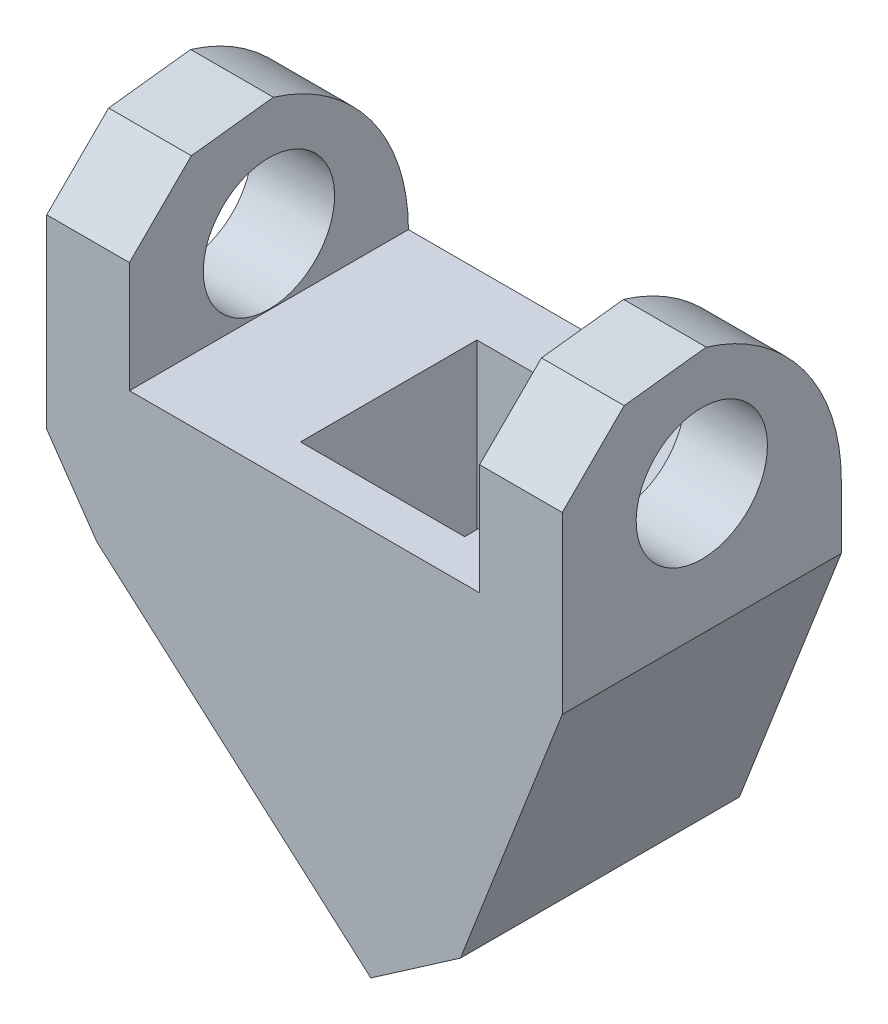
ISO-10303-21;
HEADER;
FILE_DESCRIPTION(('STEP AP214'),'2;1');
FILE_NAME('part.step','',(''),(''),'','','');
FILE_SCHEMA(('AUTOMOTIVE_DESIGN { 1 0 10303 214 1 1 1 1 }'));
ENDSEC;
DATA;
#1=APPLICATION_CONTEXT('core data for automotive mechanical design processes');
#2=APPLICATION_PROTOCOL_DEFINITION('international standard','automotive_design',2000,#1);
#3=PRODUCT_CONTEXT('',#1,'mechanical');
#4=PRODUCT('Part','Part','',(#3));
#5=PRODUCT_RELATED_PRODUCT_CATEGORY('part','',(#4));
#6=PRODUCT_DEFINITION_FORMATION('','',#4);
#7=PRODUCT_DEFINITION_CONTEXT('part definition',#1,'design');
#8=PRODUCT_DEFINITION('design','',#6,#7);
#9=PRODUCT_DEFINITION_SHAPE('','',#8);
#10=(LENGTH_UNIT() NAMED_UNIT(*) SI_UNIT(.MILLI.,.METRE.));
#11=(NAMED_UNIT(*) PLANE_ANGLE_UNIT() SI_UNIT($,.RADIAN.));
#12=(NAMED_UNIT(*) SI_UNIT($,.STERADIAN.) SOLID_ANGLE_UNIT());
#13=UNCERTAINTY_MEASURE_WITH_UNIT(LENGTH_MEASURE(1.E-05),#10,'distance_accuracy_value','');
#14=(GEOMETRIC_REPRESENTATION_CONTEXT(3) GLOBAL_UNCERTAINTY_ASSIGNED_CONTEXT((#13)) GLOBAL_UNIT_ASSIGNED_CONTEXT((#10,
#11,#12)) REPRESENTATION_CONTEXT('',''));
#15=CARTESIAN_POINT('',(0.,0.,0.));
#16=DIRECTION('',(0.,0.,1.));
#17=DIRECTION('',(1.,0.,0.));
#18=AXIS2_PLACEMENT_3D('',#15,#16,#17);
#19=CARTESIAN_POINT('',(-6.62620064692458,-23.6390631964154,17.));
#20=DIRECTION('',(0.660001667960941,0.751264133503508,0.));
#21=DIRECTION('',(-0.751264133503508,0.660001667960941,0.));
#22=AXIS2_PLACEMENT_3D('',#19,#20,#21);
#23=PLANE('',#22);
#24=DIRECTION('',(0.751264133503508,-0.660001667960941,0.));
#25=VECTOR('',#24,1.);
#26=CARTESIAN_POINT('',(-6.62620064692458,-23.6390631964154,0.));
#27=LINE('',#26,#25);
#28=CARTESIAN_POINT('',(-23.3192896933725,-8.97382613432327,0.));
#29=VERTEX_POINT('',#28);
#30=CARTESIAN_POINT('',(-6.62620064692458,-23.6390631964154,0.));
#31=VERTEX_POINT('',#30);
#32=EDGE_CURVE('E295',#29,#31,#27,.T.);
#33=ORIENTED_EDGE('',*,*,#32,.T.);
#34=DIRECTION('',(0.,0.,-1.));
#35=VECTOR('',#34,1.);
#36=CARTESIAN_POINT('',(-6.62620064692458,-23.6390631964154,17.));
#37=LINE('',#36,#35);
#38=CARTESIAN_POINT('',(-6.62620064692458,-23.6390631964154,17.));
#39=VERTEX_POINT('',#38);
#40=EDGE_CURVE('E311',#39,#31,#37,.T.);
#41=ORIENTED_EDGE('',*,*,#40,.F.);
#42=DIRECTION('',(0.751264133503508,-0.660001667960941,0.));
#43=VECTOR('',#42,1.);
#44=CARTESIAN_POINT('',(-6.62620064692458,-23.6390631964154,17.));
#45=LINE('',#44,#43);
#46=CARTESIAN_POINT('',(-23.3192896933725,-8.97382613432327,17.));
#47=VERTEX_POINT('',#46);
#48=EDGE_CURVE('E277',#47,#39,#45,.T.);
#49=ORIENTED_EDGE('',*,*,#48,.F.);
#50=DIRECTION('',(0.,0.,-1.));
#51=VECTOR('',#50,1.);
#52=CARTESIAN_POINT('',(-23.3192896933725,-8.97382613432327,17.));
#53=LINE('',#52,#51);
#54=EDGE_CURVE('E314',#47,#29,#53,.T.);
#55=ORIENTED_EDGE('',*,*,#54,.T.);
#56=EDGE_LOOP('',(#33,#41,#49,#55));
#57=FACE_BOUND('',#56,.T.);
#58=DIRECTION('',(-0.751264133503508,0.660001667960941,0.));
#59=VECTOR('',#58,1.);
#60=CARTESIAN_POINT('',(-16.9149851575088,-14.6001451442406,3.73999999999995));
#61=LINE('',#60,#59);
#62=CARTESIAN_POINT('',(-9.64628246360861,-20.9858564912125,3.73999999999995));
#63=VERTEX_POINT('',#62);
#64=CARTESIAN_POINT('',(-16.7607538078868,-14.7356406956223,3.73999999999995));
#65=VERTEX_POINT('',#64);
#66=EDGE_CURVE('E212',#63,#65,#61,.T.);
#67=ORIENTED_EDGE('',*,*,#66,.T.);
#68=DIRECTION('',(0.,0.,1.));
#69=VECTOR('',#68,1.);
#70=CARTESIAN_POINT('',(-16.7607538078868,-14.7356406956223,3.73999999999995));
#71=LINE('',#70,#69);
#72=CARTESIAN_POINT('',(-16.7607538078868,-14.7356406956223,14.4899999999999));
#73=VERTEX_POINT('',#72);
#74=EDGE_CURVE('E208',#65,#73,#71,.T.);
#75=ORIENTED_EDGE('',*,*,#74,.T.);
#76=DIRECTION('',(0.751264133503508,-0.660001667960941,0.));
#77=VECTOR('',#76,1.);
#78=CARTESIAN_POINT('',(-16.9149851575088,-14.6001451442406,14.4899999999999));
#79=LINE('',#78,#77);
#80=CARTESIAN_POINT('',(-9.64628246360861,-20.9858564912125,14.4899999999999));
#81=VERTEX_POINT('',#80);
#82=EDGE_CURVE('E211',#73,#81,#79,.T.);
#83=ORIENTED_EDGE('',*,*,#82,.T.);
#84=DIRECTION('',(0.,0.,-1.));
#85=VECTOR('',#84,1.);
#86=CARTESIAN_POINT('',(-9.64628246360861,-20.9858564912125,3.73999999999995));
#87=LINE('',#86,#85);
#88=EDGE_CURVE('E214',#81,#63,#87,.T.);
#89=ORIENTED_EDGE('',*,*,#88,.T.);
#90=EDGE_LOOP('',(#67,#75,#83,#89));
#91=FACE_BOUND('',#90,.T.);
#92=ADVANCED_FACE('F33',(#57,#91),#23,.F.);
#93=CARTESIAN_POINT('',(-21.3355501398711,11.1,17.));
#94=DIRECTION('',(-1.,0.,0.));
#95=DIRECTION('',(0.,-1.,0.));
#96=AXIS2_PLACEMENT_3D('',#93,#94,#95);
#97=PLANE('',#96);
#98=CARTESIAN_POINT('',(-21.3355501398711,4.04162085133609,8.5));
#99=DIRECTION('',(-1.,0.,0.));
#100=DIRECTION('',(0.,-1.,0.));
#101=AXIS2_PLACEMENT_3D('',#98,#99,#100);
#102=CIRCLE('',#101,4.);
#103=CARTESIAN_POINT('',(-21.3355501398711,0.0416208513360841,8.5));
#104=VERTEX_POINT('',#103);
#105=EDGE_CURVE('E435',#104,#104,#102,.T.);
#106=ORIENTED_EDGE('',*,*,#105,.T.);
#107=EDGE_LOOP('',(#106));
#108=FACE_BOUND('',#107,.T.);
#109=DIRECTION('',(0.,0.705253158861616,-0.708955557080775));
#110=VECTOR('',#109,1.);
#111=CARTESIAN_POINT('',(-21.3355501398711,8.91863795848581,14.8300297458231));
#112=LINE('',#111,#110);
#113=CARTESIAN_POINT('',(-21.3355501398711,6.76,17.));
#114=VERTEX_POINT('',#113);
#115=CARTESIAN_POINT('',(-21.3355501398711,10.5122475955982,13.2280540668032));
#116=VERTEX_POINT('',#115);
#117=EDGE_CURVE('E257',#114,#116,#112,.T.);
#118=ORIENTED_EDGE('',*,*,#117,.F.);
#119=DIRECTION('',(0.,1.,0.));
#120=VECTOR('',#119,1.);
#121=CARTESIAN_POINT('',(-21.3355501398711,11.1,17.));
#122=LINE('',#121,#120);
#123=CARTESIAN_POINT('',(-21.3355501398711,0.,17.));
#124=VERTEX_POINT('',#123);
#125=EDGE_CURVE('E269',#124,#114,#122,.T.);
#126=ORIENTED_EDGE('',*,*,#125,.F.);
#127=DIRECTION('',(0.,0.,-1.));
#128=VECTOR('',#127,1.);
#129=CARTESIAN_POINT('',(-21.3355501398711,0.,17.));
#130=LINE('',#129,#128);
#131=CARTESIAN_POINT('',(-21.3355501398711,0.,0.));
#132=VERTEX_POINT('',#131);
#133=EDGE_CURVE('E320',#124,#132,#130,.T.);
#134=ORIENTED_EDGE('',*,*,#133,.T.);
#135=CARTESIAN_POINT('',(-21.3355501398711,0.,11.6012165316514));
#136=DIRECTION('',(-1.,0.,0.));
#137=DIRECTION('',(0.,-1.,0.));
#138=AXIS2_PLACEMENT_3D('',#135,#136,#137);
#139=CIRCLE('',#138,11.6012165316514);
#140=CARTESIAN_POINT('',(-21.3355501398711,11.1,8.22805406680315));
#141=VERTEX_POINT('',#140);
#142=EDGE_CURVE('E249',#141,#132,#139,.T.);
#143=ORIENTED_EDGE('',*,*,#142,.F.);
#144=DIRECTION('',(0.,0.116746638974287,-0.993161730177018));
#145=VECTOR('',#144,1.);
#146=CARTESIAN_POINT('',(-21.3355501398711,10.0829078343711,16.8804403268307));
#147=LINE('',#146,#145);
#148=EDGE_CURVE('E263',#116,#141,#147,.T.);
#149=ORIENTED_EDGE('',*,*,#148,.F.);
#150=EDGE_LOOP('',(#118,#126,#134,#143,#149));
#151=FACE_BOUND('',#150,.T.);
#152=ADVANCED_FACE('F358',(#108,#151),#97,.F.);
#153=CARTESIAN_POINT('',(-26.3755501398711,-4.55837914866391,17.));
#154=DIRECTION('',(1.,0.,0.));
#155=DIRECTION('',(0.,0.,-1.));
#156=AXIS2_PLACEMENT_3D('',#153,#154,#155);
#157=PLANE('',#156);
#158=CARTESIAN_POINT('',(-26.3755501398711,4.04162085133609,8.5));
#159=DIRECTION('',(1.,0.,0.));
#160=DIRECTION('',(0.,0.,-1.));
#161=AXIS2_PLACEMENT_3D('',#158,#159,#160);
#162=CIRCLE('',#161,4.);
#163=CARTESIAN_POINT('',(-26.3755501398711,4.04162085133609,4.5));
#164=VERTEX_POINT('',#163);
#165=EDGE_CURVE('E433',#164,#164,#162,.T.);
#166=ORIENTED_EDGE('',*,*,#165,.T.);
#167=EDGE_LOOP('',(#166));
#168=FACE_BOUND('',#167,.T.);
#169=DIRECTION('',(0.,-0.705253158861616,0.708955557080775));
#170=VECTOR('',#169,1.);
#171=CARTESIAN_POINT('',(-26.3755501398711,1.13044173759442,22.6591119995615));
#172=LINE('',#171,#170);
#173=CARTESIAN_POINT('',(-26.3755501398711,10.5122475955982,13.2280540668032));
#174=VERTEX_POINT('',#173);
#175=CARTESIAN_POINT('',(-26.3755501398711,6.76,17.));
#176=VERTEX_POINT('',#175);
#177=EDGE_CURVE('E255',#174,#176,#172,.T.);
#178=ORIENTED_EDGE('',*,*,#177,.F.);
#179=DIRECTION('',(0.,-0.116746638974287,0.993161730177018));
#180=VECTOR('',#179,1.);
#181=CARTESIAN_POINT('',(-26.3755501398711,9.86948760724782,18.6960026752353));
#182=LINE('',#181,#180);
#183=CARTESIAN_POINT('',(-26.3755501398711,11.1,8.22805406680315));
#184=VERTEX_POINT('',#183);
#185=EDGE_CURVE('E261',#184,#174,#182,.T.);
#186=ORIENTED_EDGE('',*,*,#185,.F.);
#187=CARTESIAN_POINT('',(-26.3755501398711,0.,11.6012165316514));
#188=DIRECTION('',(1.,0.,0.));
#189=DIRECTION('',(0.,0.,-1.));
#190=AXIS2_PLACEMENT_3D('',#187,#188,#189);
#191=CIRCLE('',#190,11.6012165316514);
#192=CARTESIAN_POINT('',(-26.3755501398711,0.,0.));
#193=VERTEX_POINT('',#192);
#194=EDGE_CURVE('E247',#193,#184,#191,.T.);
#195=ORIENTED_EDGE('',*,*,#194,.F.);
#196=DIRECTION('',(0.,-1.,0.));
#197=VECTOR('',#196,1.);
#198=CARTESIAN_POINT('',(-26.3755501398711,-4.55837914866391,0.));
#199=LINE('',#198,#197);
#200=CARTESIAN_POINT('',(-26.3755501398711,-4.55837914866391,0.));
#201=VERTEX_POINT('',#200);
#202=EDGE_CURVE('E291',#193,#201,#199,.T.);
#203=ORIENTED_EDGE('',*,*,#202,.T.);
#204=DIRECTION('',(0.,0.,-1.));
#205=VECTOR('',#204,1.);
#206=CARTESIAN_POINT('',(-26.3755501398711,-4.55837914866391,17.));
#207=LINE('',#206,#205);
#208=CARTESIAN_POINT('',(-26.3755501398711,-4.55837914866391,17.));
#209=VERTEX_POINT('',#208);
#210=EDGE_CURVE('E317',#209,#201,#207,.T.);
#211=ORIENTED_EDGE('',*,*,#210,.F.);
#212=DIRECTION('',(0.,-1.,0.));
#213=VECTOR('',#212,1.);
#214=CARTESIAN_POINT('',(-26.3755501398711,-4.55837914866391,17.));
#215=LINE('',#214,#213);
#216=EDGE_CURVE('E273',#176,#209,#215,.T.);
#217=ORIENTED_EDGE('',*,*,#216,.F.);
#218=EDGE_LOOP('',(#178,#186,#195,#203,#211,#217));
#219=FACE_BOUND('',#218,.T.);
#220=ADVANCED_FACE('F394',(#168,#219),#157,.F.);
#221=CARTESIAN_POINT('',(5.04,11.1,17.));
#222=DIRECTION('',(-1.,0.,0.));
#223=DIRECTION('',(0.,-1.,0.));
#224=AXIS2_PLACEMENT_3D('',#221,#222,#223);
#225=PLANE('',#224);
#226=CARTESIAN_POINT('',(5.04,4.04162085133608,8.5));
#227=DIRECTION('',(-1.,0.,0.));
#228=DIRECTION('',(0.,-1.,0.));
#229=AXIS2_PLACEMENT_3D('',#226,#227,#228);
#230=CIRCLE('',#229,4.);
#231=CARTESIAN_POINT('',(5.04,0.0416208513360763,8.5));
#232=VERTEX_POINT('',#231);
#233=EDGE_CURVE('E436',#232,#232,#230,.T.);
#234=ORIENTED_EDGE('',*,*,#233,.T.);
#235=EDGE_LOOP('',(#234));
#236=FACE_BOUND('',#235,.T.);
#237=DIRECTION('',(0.,0.705253158861616,-0.708955557080775));
#238=VECTOR('',#237,1.);
#239=CARTESIAN_POINT('',(5.04,8.91863795848581,14.8300297458231));
#240=LINE('',#239,#238);
#241=CARTESIAN_POINT('',(5.04,6.76,17.));
#242=VERTEX_POINT('',#241);
#243=CARTESIAN_POINT('',(5.04,10.5122475955982,13.2280540668032));
#244=VERTEX_POINT('',#243);
#245=EDGE_CURVE('E253',#242,#244,#240,.T.);
#246=ORIENTED_EDGE('',*,*,#245,.F.);
#247=DIRECTION('',(0.,1.,0.));
#248=VECTOR('',#247,1.);
#249=CARTESIAN_POINT('',(5.04,11.1,17.));
#250=LINE('',#249,#248);
#251=CARTESIAN_POINT('',(5.04,-3.9,17.));
#252=VERTEX_POINT('',#251);
#253=EDGE_CURVE('E283',#252,#242,#250,.T.);
#254=ORIENTED_EDGE('',*,*,#253,.F.);
#255=DIRECTION('',(0.,0.,-1.));
#256=VECTOR('',#255,1.);
#257=CARTESIAN_POINT('',(5.04,-3.9,17.));
#258=LINE('',#257,#256);
#259=CARTESIAN_POINT('',(5.04,-3.9,0.));
#260=VERTEX_POINT('',#259);
#261=EDGE_CURVE('E305',#252,#260,#258,.T.);
#262=ORIENTED_EDGE('',*,*,#261,.T.);
#263=DIRECTION('',(0.,1.,0.));
#264=VECTOR('',#263,1.);
#265=CARTESIAN_POINT('',(5.04,11.1,0.));
#266=LINE('',#265,#264);
#267=CARTESIAN_POINT('',(5.04,0.,0.));
#268=VERTEX_POINT('',#267);
#269=EDGE_CURVE('E270',#260,#268,#266,.T.);
#270=ORIENTED_EDGE('',*,*,#269,.T.);
#271=CARTESIAN_POINT('',(5.04,0.,11.6012165316514));
#272=DIRECTION('',(-1.,0.,0.));
#273=DIRECTION('',(0.,-1.,0.));
#274=AXIS2_PLACEMENT_3D('',#271,#272,#273);
#275=CIRCLE('',#274,11.6012165316514);
#276=CARTESIAN_POINT('',(5.04,11.1,8.22805406680315));
#277=VERTEX_POINT('',#276);
#278=EDGE_CURVE('E245',#277,#268,#275,.T.);
#279=ORIENTED_EDGE('',*,*,#278,.F.);
#280=DIRECTION('',(0.,0.116746638974287,-0.993161730177018));
#281=VECTOR('',#280,1.);
#282=CARTESIAN_POINT('',(5.04,10.0829078343711,16.8804403268307));
#283=LINE('',#282,#281);
#284=EDGE_CURVE('E259',#244,#277,#283,.T.);
#285=ORIENTED_EDGE('',*,*,#284,.F.);
#286=EDGE_LOOP('',(#246,#254,#262,#270,#279,#285));
#287=FACE_BOUND('',#286,.T.);
#288=ADVANCED_FACE('F370',(#236,#287),#225,.F.);
#289=CARTESIAN_POINT('',(0.,0.,17.));
#290=DIRECTION('',(1.,0.,0.));
#291=DIRECTION('',(0.,0.,-1.));
#292=AXIS2_PLACEMENT_3D('',#289,#290,#291);
#293=PLANE('',#292);
#294=CARTESIAN_POINT('',(0.,4.04162085133608,8.5));
#295=DIRECTION('',(1.,0.,0.));
#296=DIRECTION('',(0.,0.,-1.));
#297=AXIS2_PLACEMENT_3D('',#294,#295,#296);
#298=CIRCLE('',#297,4.);
#299=CARTESIAN_POINT('',(0.,4.04162085133608,4.5));
#300=VERTEX_POINT('',#299);
#301=EDGE_CURVE('E37',#300,#300,#298,.T.);
#302=ORIENTED_EDGE('',*,*,#301,.T.);
#303=EDGE_LOOP('',(#302));
#304=FACE_BOUND('',#303,.T.);
#305=DIRECTION('',(0.,-0.705253158861616,0.708955557080775));
#306=VECTOR('',#305,1.);
#307=CARTESIAN_POINT('',(0.,3.39769755775021,20.3799536677963));
#308=LINE('',#307,#306);
#309=CARTESIAN_POINT('',(0.,10.5122475955982,13.2280540668032));
#310=VERTEX_POINT('',#309);
#311=CARTESIAN_POINT('',(0.,6.76,17.));
#312=VERTEX_POINT('',#311);
#313=EDGE_CURVE('E251',#310,#312,#308,.T.);
#314=ORIENTED_EDGE('',*,*,#313,.F.);
#315=DIRECTION('',(0.,-0.116746638974287,0.993161730177018));
#316=VECTOR('',#315,1.);
#317=CARTESIAN_POINT('',(0.,9.93161730177018,18.1674663897429));
#318=LINE('',#317,#316);
#319=CARTESIAN_POINT('',(0.,11.1,8.22805406680315));
#320=VERTEX_POINT('',#319);
#321=EDGE_CURVE('E11',#320,#310,#318,.T.);
#322=ORIENTED_EDGE('',*,*,#321,.F.);
#323=CARTESIAN_POINT('',(0.,0.,11.6012165316514));
#324=DIRECTION('',(1.,0.,0.));
#325=DIRECTION('',(0.,0.,-1.));
#326=AXIS2_PLACEMENT_3D('',#323,#324,#325);
#327=CIRCLE('',#326,11.6012165316514);
#328=CARTESIAN_POINT('',(0.,0.,0.));
#329=VERTEX_POINT('',#328);
#330=EDGE_CURVE('E243',#329,#320,#327,.T.);
#331=ORIENTED_EDGE('',*,*,#330,.F.);
#332=DIRECTION('',(0.,0.,-1.));
#333=VECTOR('',#332,1.);
#334=CARTESIAN_POINT('',(0.,0.,17.));
#335=LINE('',#334,#333);
#336=CARTESIAN_POINT('',(0.,0.,17.));
#337=VERTEX_POINT('',#336);
#338=EDGE_CURVE('E288',#337,#329,#335,.T.);
#339=ORIENTED_EDGE('',*,*,#338,.F.);
#340=DIRECTION('',(0.,-1.,0.));
#341=VECTOR('',#340,1.);
#342=CARTESIAN_POINT('',(0.,0.,17.));
#343=LINE('',#342,#341);
#344=EDGE_CURVE('E286',#312,#337,#343,.T.);
#345=ORIENTED_EDGE('',*,*,#344,.F.);
#346=EDGE_LOOP('',(#314,#322,#331,#339,#345));
#347=FACE_BOUND('',#346,.T.);
#348=ADVANCED_FACE('F345',(#304,#347),#293,.F.);
#349=CARTESIAN_POINT('',(0.,0.,17.));
#350=DIRECTION('',(0.,0.,1.));
#351=DIRECTION('',(1.,0.,0.));
#352=AXIS2_PLACEMENT_3D('',#349,#350,#351);
#353=PLANE('',#352);
#354=ORIENTED_EDGE('',*,*,#253,.T.);
#355=DIRECTION('',(-1.,0.,0.));
#356=VECTOR('',#355,1.);
#357=CARTESIAN_POINT('',(0.,6.76,17.));
#358=LINE('',#357,#356);
#359=EDGE_CURVE('E42',#242,#312,#358,.T.);
#360=ORIENTED_EDGE('',*,*,#359,.T.);
#361=ORIENTED_EDGE('',*,*,#344,.T.);
#362=DIRECTION('',(-1.,0.,0.));
#363=VECTOR('',#362,1.);
#364=CARTESIAN_POINT('',(-21.3355501398711,0.,17.));
#365=LINE('',#364,#363);
#366=EDGE_CURVE('E266',#337,#124,#365,.T.);
#367=ORIENTED_EDGE('',*,*,#366,.T.);
#368=ORIENTED_EDGE('',*,*,#125,.T.);
#369=EDGE_CURVE('E326',#114,#176,#358,.T.);
#370=ORIENTED_EDGE('',*,*,#369,.T.);
#371=ORIENTED_EDGE('',*,*,#216,.T.);
#372=DIRECTION('',(0.569136023556532,-0.822243386528744,0.));
#373=VECTOR('',#372,1.);
#374=CARTESIAN_POINT('',(-23.3192896933725,-8.97382613432327,17.));
#375=LINE('',#374,#373);
#376=EDGE_CURVE('E275',#209,#47,#375,.T.);
#377=ORIENTED_EDGE('',*,*,#376,.T.);
#378=ORIENTED_EDGE('',*,*,#48,.T.);
#379=DIRECTION('',(0.822243386528745,0.569136023556532,0.));
#380=VECTOR('',#379,1.);
#381=CARTESIAN_POINT('',(-1.16650456037372,-19.86,17.));
#382=LINE('',#381,#380);
#383=CARTESIAN_POINT('',(-1.16650456037372,-19.86,17.));
#384=VERTEX_POINT('',#383);
#385=EDGE_CURVE('E279',#39,#384,#382,.T.);
#386=ORIENTED_EDGE('',*,*,#385,.T.);
#387=DIRECTION('',(0.362438038283702,0.932007869282798,0.));
#388=VECTOR('',#387,1.);
#389=CARTESIAN_POINT('',(5.04,-3.9,17.));
#390=LINE('',#389,#388);
#391=EDGE_CURVE('E281',#384,#252,#390,.T.);
#392=ORIENTED_EDGE('',*,*,#391,.T.);
#393=EDGE_LOOP('',(#354,#360,#361,#367,#368,#370,#371,#377,#378,#386,#392));
#394=FACE_BOUND('',#393,.T.);
#395=ADVANCED_FACE('F360',(#394),#353,.T.);
#396=CARTESIAN_POINT('',(0.,0.,0.));
#397=DIRECTION('',(0.,0.,1.));
#398=DIRECTION('',(1.,0.,0.));
#399=AXIS2_PLACEMENT_3D('',#396,#397,#398);
#400=PLANE('',#399);
#401=DIRECTION('',(-1.,0.,0.));
#402=VECTOR('',#401,1.);
#403=CARTESIAN_POINT('',(31.,0.,0.));
#404=LINE('',#403,#402);
#405=EDGE_CURVE('E325',#268,#329,#404,.T.);
#406=ORIENTED_EDGE('',*,*,#405,.F.);
#407=ORIENTED_EDGE('',*,*,#269,.F.);
#408=DIRECTION('',(0.362438038283702,0.932007869282798,0.));
#409=VECTOR('',#408,1.);
#410=CARTESIAN_POINT('',(5.04,-3.9,0.));
#411=LINE('',#410,#409);
#412=CARTESIAN_POINT('',(-1.16650456037372,-19.86,0.));
#413=VERTEX_POINT('',#412);
#414=EDGE_CURVE('E299',#413,#260,#411,.T.);
#415=ORIENTED_EDGE('',*,*,#414,.F.);
#416=DIRECTION('',(0.822243386528745,0.569136023556532,0.));
#417=VECTOR('',#416,1.);
#418=CARTESIAN_POINT('',(-1.16650456037372,-19.86,0.));
#419=LINE('',#418,#417);
#420=EDGE_CURVE('E297',#31,#413,#419,.T.);
#421=ORIENTED_EDGE('',*,*,#420,.F.);
#422=ORIENTED_EDGE('',*,*,#32,.F.);
#423=DIRECTION('',(0.569136023556532,-0.822243386528744,0.));
#424=VECTOR('',#423,1.);
#425=CARTESIAN_POINT('',(-23.3192896933725,-8.97382613432327,0.));
#426=LINE('',#425,#424);
#427=EDGE_CURVE('E293',#201,#29,#426,.T.);
#428=ORIENTED_EDGE('',*,*,#427,.F.);
#429=ORIENTED_EDGE('',*,*,#202,.F.);
#430=EDGE_CURVE('E323',#132,#193,#404,.T.);
#431=ORIENTED_EDGE('',*,*,#430,.F.);
#432=DIRECTION('',(-1.,0.,0.));
#433=VECTOR('',#432,1.);
#434=CARTESIAN_POINT('',(-21.3355501398711,0.,0.));
#435=LINE('',#434,#433);
#436=EDGE_CURVE('E265',#329,#132,#435,.T.);
#437=ORIENTED_EDGE('',*,*,#436,.F.);
#438=EDGE_LOOP('',(#406,#407,#415,#421,#422,#428,#429,#431,#437));
#439=FACE_BOUND('',#438,.T.);
#440=ADVANCED_FACE('F350',(#439),#400,.F.);
#441=CARTESIAN_POINT('',(-21.3355501398711,0.,17.));
#442=DIRECTION('',(0.,-1.,0.));
#443=DIRECTION('',(0.,0.,-1.));
#444=AXIS2_PLACEMENT_3D('',#441,#442,#443);
#445=PLANE('',#444);
#446=DIRECTION('',(-1.,0.,0.));
#447=VECTOR('',#446,1.);
#448=CARTESIAN_POINT('',(-3.42,0.,3.74));
#449=LINE('',#448,#447);
#450=CARTESIAN_POINT('',(-3.42,0.,3.74));
#451=VERTEX_POINT('',#450);
#452=CARTESIAN_POINT('',(-13.42,0.,3.74));
#453=VERTEX_POINT('',#452);
#454=EDGE_CURVE('E187',#451,#453,#449,.T.);
#455=ORIENTED_EDGE('',*,*,#454,.F.);
#456=DIRECTION('',(0.,0.,-1.));
#457=VECTOR('',#456,1.);
#458=CARTESIAN_POINT('',(-3.42,0.,14.49));
#459=LINE('',#458,#457);
#460=CARTESIAN_POINT('',(-3.42,0.,14.49));
#461=VERTEX_POINT('',#460);
#462=EDGE_CURVE('E49',#461,#451,#459,.T.);
#463=ORIENTED_EDGE('',*,*,#462,.F.);
#464=DIRECTION('',(1.,0.,0.));
#465=VECTOR('',#464,1.);
#466=CARTESIAN_POINT('',(-3.42,0.,14.49));
#467=LINE('',#466,#465);
#468=CARTESIAN_POINT('',(-13.42,0.,14.49));
#469=VERTEX_POINT('',#468);
#470=EDGE_CURVE('E194',#469,#461,#467,.T.);
#471=ORIENTED_EDGE('',*,*,#470,.F.);
#472=DIRECTION('',(0.,0.,1.));
#473=VECTOR('',#472,1.);
#474=CARTESIAN_POINT('',(-13.42,0.,14.49));
#475=LINE('',#474,#473);
#476=EDGE_CURVE('E178',#453,#469,#475,.T.);
#477=ORIENTED_EDGE('',*,*,#476,.F.);
#478=EDGE_LOOP('',(#455,#463,#471,#477));
#479=FACE_BOUND('',#478,.T.);
#480=ORIENTED_EDGE('',*,*,#436,.T.);
#481=ORIENTED_EDGE('',*,*,#133,.F.);
#482=ORIENTED_EDGE('',*,*,#366,.F.);
#483=ORIENTED_EDGE('',*,*,#338,.T.);
#484=EDGE_LOOP('',(#480,#481,#482,#483));
#485=FACE_BOUND('',#484,.T.);
#486=ADVANCED_FACE('F35',(#479,#485),#445,.F.);
#487=CARTESIAN_POINT('',(-23.3192896933725,-8.97382613432327,17.));
#488=DIRECTION('',(0.822243386528744,0.569136023556532,0.));
#489=DIRECTION('',(-0.569136023556532,0.822243386528744,0.));
#490=AXIS2_PLACEMENT_3D('',#487,#488,#489);
#491=PLANE('',#490);
#492=ORIENTED_EDGE('',*,*,#427,.T.);
#493=ORIENTED_EDGE('',*,*,#54,.F.);
#494=ORIENTED_EDGE('',*,*,#376,.F.);
#495=ORIENTED_EDGE('',*,*,#210,.T.);
#496=EDGE_LOOP('',(#492,#493,#494,#495));
#497=FACE_BOUND('',#496,.T.);
#498=ADVANCED_FACE('F389',(#497),#491,.F.);
#499=CARTESIAN_POINT('',(-1.16650456037372,-19.86,17.));
#500=DIRECTION('',(-0.569136023556532,0.822243386528745,0.));
#501=DIRECTION('',(-0.822243386528745,-0.569136023556532,0.));
#502=AXIS2_PLACEMENT_3D('',#499,#500,#501);
#503=PLANE('',#502);
#504=ORIENTED_EDGE('',*,*,#420,.T.);
#505=DIRECTION('',(0.,0.,-1.));
#506=VECTOR('',#505,1.);
#507=CARTESIAN_POINT('',(-1.16650456037372,-19.86,17.));
#508=LINE('',#507,#506);
#509=EDGE_CURVE('E308',#384,#413,#508,.T.);
#510=ORIENTED_EDGE('',*,*,#509,.F.);
#511=ORIENTED_EDGE('',*,*,#385,.F.);
#512=ORIENTED_EDGE('',*,*,#40,.T.);
#513=EDGE_LOOP('',(#504,#510,#511,#512));
#514=FACE_BOUND('',#513,.T.);
#515=ADVANCED_FACE('F382',(#514),#503,.F.);
#516=CARTESIAN_POINT('',(5.04,-3.9,17.));
#517=DIRECTION('',(-0.932007869282799,0.362438038283702,0.));
#518=DIRECTION('',(-0.362438038283702,-0.932007869282798,0.));
#519=AXIS2_PLACEMENT_3D('',#516,#517,#518);
#520=PLANE('',#519);
#521=ORIENTED_EDGE('',*,*,#414,.T.);
#522=ORIENTED_EDGE('',*,*,#261,.F.);
#523=ORIENTED_EDGE('',*,*,#391,.F.);
#524=ORIENTED_EDGE('',*,*,#509,.T.);
#525=EDGE_LOOP('',(#521,#522,#523,#524));
#526=FACE_BOUND('',#525,.T.);
#527=ADVANCED_FACE('F377',(#526),#520,.F.);
#528=CARTESIAN_POINT('',(31.,0.,11.6012165316514));
#529=DIRECTION('',(-1.,0.,0.));
#530=DIRECTION('',(0.,-1.,0.));
#531=AXIS2_PLACEMENT_3D('',#528,#529,#530);
#532=CYLINDRICAL_SURFACE('',#531,11.6012165316514);
#533=ORIENTED_EDGE('',*,*,#142,.T.);
#534=ORIENTED_EDGE('',*,*,#430,.T.);
#535=ORIENTED_EDGE('',*,*,#194,.T.);
#536=DIRECTION('',(-1.,0.,0.));
#537=VECTOR('',#536,1.);
#538=CARTESIAN_POINT('',(31.,11.1,8.22805406680315));
#539=LINE('',#538,#537);
#540=EDGE_CURVE('E217',#141,#184,#539,.T.);
#541=ORIENTED_EDGE('',*,*,#540,.F.);
#542=EDGE_LOOP('',(#533,#534,#535,#541));
#543=FACE_BOUND('',#542,.T.);
#544=ADVANCED_FACE('F397',(#543),#532,.T.);
#545=CARTESIAN_POINT('',(31.,11.8975810418533,11.8354479752292));
#546=DIRECTION('',(0.,0.708955557080775,0.705253158861616));
#547=DIRECTION('',(0.,-0.705253158861616,0.708955557080775));
#548=AXIS2_PLACEMENT_3D('',#545,#546,#547);
#549=PLANE('',#548);
#550=ORIENTED_EDGE('',*,*,#117,.T.);
#551=DIRECTION('',(-1.,0.,0.));
#552=VECTOR('',#551,1.);
#553=CARTESIAN_POINT('',(31.,10.5122475955982,13.2280540668032));
#554=LINE('',#553,#552);
#555=EDGE_CURVE('E236',#116,#174,#554,.T.);
#556=ORIENTED_EDGE('',*,*,#555,.T.);
#557=ORIENTED_EDGE('',*,*,#177,.T.);
#558=ORIENTED_EDGE('',*,*,#369,.F.);
#559=EDGE_LOOP('',(#550,#556,#557,#558));
#560=FACE_BOUND('',#559,.T.);
#561=ADVANCED_FACE('F402',(#560),#549,.T.);
#562=CARTESIAN_POINT('',(31.,11.9027382990231,1.39917261084334));
#563=DIRECTION('',(0.,0.993161730177018,0.116746638974287));
#564=DIRECTION('',(0.,-0.116746638974287,0.993161730177018));
#565=AXIS2_PLACEMENT_3D('',#562,#563,#564);
#566=PLANE('',#565);
#567=ORIENTED_EDGE('',*,*,#148,.T.);
#568=ORIENTED_EDGE('',*,*,#540,.T.);
#569=ORIENTED_EDGE('',*,*,#185,.T.);
#570=ORIENTED_EDGE('',*,*,#555,.F.);
#571=EDGE_LOOP('',(#567,#568,#569,#570));
#572=FACE_BOUND('',#571,.T.);
#573=ADVANCED_FACE('F399',(#572),#566,.T.);
#574=ORIENTED_EDGE('',*,*,#284,.T.);
#575=EDGE_CURVE('E240',#277,#320,#539,.T.);
#576=ORIENTED_EDGE('',*,*,#575,.T.);
#577=ORIENTED_EDGE('',*,*,#321,.T.);
#578=EDGE_CURVE('E239',#244,#310,#554,.T.);
#579=ORIENTED_EDGE('',*,*,#578,.F.);
#580=EDGE_LOOP('',(#574,#576,#577,#579));
#581=FACE_BOUND('',#580,.T.);
#582=ADVANCED_FACE('F368',(#581),#566,.T.);
#583=ORIENTED_EDGE('',*,*,#245,.T.);
#584=ORIENTED_EDGE('',*,*,#578,.T.);
#585=ORIENTED_EDGE('',*,*,#313,.T.);
#586=ORIENTED_EDGE('',*,*,#359,.F.);
#587=EDGE_LOOP('',(#583,#584,#585,#586));
#588=FACE_BOUND('',#587,.T.);
#589=ADVANCED_FACE('F363',(#588),#549,.T.);
#590=ORIENTED_EDGE('',*,*,#278,.T.);
#591=ORIENTED_EDGE('',*,*,#405,.T.);
#592=ORIENTED_EDGE('',*,*,#330,.T.);
#593=ORIENTED_EDGE('',*,*,#575,.F.);
#594=EDGE_LOOP('',(#590,#591,#592,#593));
#595=FACE_BOUND('',#594,.T.);
#596=ADVANCED_FACE('F334',(#595),#532,.T.);
#597=CARTESIAN_POINT('',(-7.30160744155989,-11.101956102779,0.));
#598=DIRECTION('',(0.660001667960941,0.751264133503507,0.));
#599=DIRECTION('',(-0.751264133503507,0.660001667960941,0.));
#600=AXIS2_PLACEMENT_3D('',#597,#598,#599);
#601=PLANE('',#600);
#602=DIRECTION('',(-0.751264133503507,0.660001667960941,0.));
#603=VECTOR('',#602,1.);
#604=CARTESIAN_POINT('',(-9.45488501984779,-9.21025552787554,14.4899999999999));
#605=LINE('',#604,#603);
#606=CARTESIAN_POINT('',(-2.34041367556956,-15.4604713234657,14.4899999999999));
#607=VERTEX_POINT('',#606);
#608=CARTESIAN_POINT('',(-3.42,-14.5120315629928,14.49));
#609=VERTEX_POINT('',#608);
#610=EDGE_CURVE('E221',#607,#609,#605,.T.);
#611=ORIENTED_EDGE('',*,*,#610,.T.);
#612=DIRECTION('',(0.,0.,-1.));
#613=VECTOR('',#612,1.);
#614=CARTESIAN_POINT('',(-3.42,-14.5120315629928,0.));
#615=LINE('',#614,#613);
#616=CARTESIAN_POINT('',(-3.42,-14.5120315629928,3.74));
#617=VERTEX_POINT('',#616);
#618=EDGE_CURVE('E201',#609,#617,#615,.T.);
#619=ORIENTED_EDGE('',*,*,#618,.T.);
#620=DIRECTION('',(0.751264133503508,-0.660001667960941,0.));
#621=VECTOR('',#620,1.);
#622=CARTESIAN_POINT('',(-9.45488501984779,-9.21025552787554,3.73999999999995));
#623=LINE('',#622,#621);
#624=CARTESIAN_POINT('',(-2.34041367556955,-15.4604713234657,3.73999999999995));
#625=VERTEX_POINT('',#624);
#626=EDGE_CURVE('E229',#617,#625,#623,.T.);
#627=ORIENTED_EDGE('',*,*,#626,.T.);
#628=DIRECTION('',(0.,0.,1.));
#629=VECTOR('',#628,1.);
#630=CARTESIAN_POINT('',(-2.34041367556957,-15.4604713234657,3.73999999999995));
#631=LINE('',#630,#629);
#632=EDGE_CURVE('E218',#625,#607,#631,.T.);
#633=ORIENTED_EDGE('',*,*,#632,.T.);
#634=EDGE_LOOP('',(#611,#619,#627,#633));
#635=FACE_BOUND('',#634,.T.);
#636=ADVANCED_FACE('F474',(#635),#601,.F.);
#637=CARTESIAN_POINT('',(-17.575068013985,-15.3515016926918,3.73999999999995));
#638=DIRECTION('',(0.,0.,1.));
#639=DIRECTION('',(0.,-1.,0.));
#640=AXIS2_PLACEMENT_3D('',#637,#638,#639);
#641=PLANE('',#640);
#642=ORIENTED_EDGE('',*,*,#626,.F.);
#643=DIRECTION('',(0.,1.,0.));
#644=VECTOR('',#643,1.);
#645=CARTESIAN_POINT('',(-3.42,-36.6035261952489,3.74));
#646=LINE('',#645,#644);
#647=EDGE_CURVE('E184',#617,#451,#646,.T.);
#648=ORIENTED_EDGE('',*,*,#647,.T.);
#649=ORIENTED_EDGE('',*,*,#454,.T.);
#650=DIRECTION('',(0.,1.,0.));
#651=VECTOR('',#650,1.);
#652=CARTESIAN_POINT('',(-13.42,-36.6035261952489,3.74));
#653=LINE('',#652,#651);
#654=CARTESIAN_POINT('',(-13.42,-12.2090484346976,3.73999999999995));
#655=VERTEX_POINT('',#654);
#656=EDGE_CURVE('E57',#655,#453,#653,.T.);
#657=ORIENTED_EDGE('',*,*,#656,.F.);
#658=DIRECTION('',(0.79758392882523,0.603207987745281,0.));
#659=VECTOR('',#658,1.);
#660=CARTESIAN_POINT('',(-17.575068013985,-15.3515016926918,3.73999999999995));
#661=LINE('',#660,#659);
#662=EDGE_CURVE('E222',#65,#655,#661,.T.);
#663=ORIENTED_EDGE('',*,*,#662,.F.);
#664=ORIENTED_EDGE('',*,*,#66,.F.);
#665=DIRECTION('',(0.79758392882523,0.603207987745281,0.));
#666=VECTOR('',#665,1.);
#667=CARTESIAN_POINT('',(-10.4605966697068,-21.6017174882819,3.73999999999995));
#668=LINE('',#667,#666);
#669=EDGE_CURVE('E207',#63,#625,#668,.T.);
#670=ORIENTED_EDGE('',*,*,#669,.T.);
#671=EDGE_LOOP('',(#642,#648,#649,#657,#663,#664,#670));
#672=FACE_BOUND('',#671,.T.);
#673=ADVANCED_FACE('F189',(#672),#641,.T.);
#674=CARTESIAN_POINT('',(-17.575068013985,-15.3515016926918,3.73999999999995));
#675=DIRECTION('',(0.603207987745281,-0.79758392882523,0.));
#676=DIRECTION('',(0.79758392882523,0.603207987745281,0.));
#677=AXIS2_PLACEMENT_3D('',#674,#675,#676);
#678=PLANE('',#677);
#679=DIRECTION('',(0.,0.,-1.));
#680=VECTOR('',#679,1.);
#681=CARTESIAN_POINT('',(-13.42,-12.2090484346976,3.73999999999995));
#682=LINE('',#681,#680);
#683=CARTESIAN_POINT('',(-13.42,-12.2090484346976,14.49));
#684=VERTEX_POINT('',#683);
#685=EDGE_CURVE('E181',#684,#655,#682,.T.);
#686=ORIENTED_EDGE('',*,*,#685,.F.);
#687=DIRECTION('',(0.79758392882523,0.603207987745281,0.));
#688=VECTOR('',#687,1.);
#689=CARTESIAN_POINT('',(-17.575068013985,-15.3515016926918,14.4899999999999));
#690=LINE('',#689,#688);
#691=EDGE_CURVE('E225',#73,#684,#690,.T.);
#692=ORIENTED_EDGE('',*,*,#691,.F.);
#693=ORIENTED_EDGE('',*,*,#74,.F.);
#694=ORIENTED_EDGE('',*,*,#662,.T.);
#695=EDGE_LOOP('',(#686,#692,#693,#694));
#696=FACE_BOUND('',#695,.T.);
#697=ADVANCED_FACE('F468',(#696),#678,.T.);
#698=CARTESIAN_POINT('',(-17.575068013985,-15.3515016926918,14.4899999999999));
#699=DIRECTION('',(0.,0.,-1.));
#700=DIRECTION('',(-1.,0.,0.));
#701=AXIS2_PLACEMENT_3D('',#698,#699,#700);
#702=PLANE('',#701);
#703=DIRECTION('',(0.,1.,0.));
#704=VECTOR('',#703,1.);
#705=CARTESIAN_POINT('',(-3.42,-36.6035261952489,14.49));
#706=LINE('',#705,#704);
#707=EDGE_CURVE('E199',#609,#461,#706,.T.);
#708=ORIENTED_EDGE('',*,*,#707,.F.);
#709=ORIENTED_EDGE('',*,*,#610,.F.);
#710=DIRECTION('',(0.79758392882523,0.603207987745281,0.));
#711=VECTOR('',#710,1.);
#712=CARTESIAN_POINT('',(-10.4605966697068,-21.6017174882819,14.4899999999999));
#713=LINE('',#712,#711);
#714=EDGE_CURVE('E223',#81,#607,#713,.T.);
#715=ORIENTED_EDGE('',*,*,#714,.F.);
#716=ORIENTED_EDGE('',*,*,#82,.F.);
#717=ORIENTED_EDGE('',*,*,#691,.T.);
#718=DIRECTION('',(0.,1.,0.));
#719=VECTOR('',#718,1.);
#720=CARTESIAN_POINT('',(-13.42,-36.6035261952489,14.49));
#721=LINE('',#720,#719);
#722=EDGE_CURVE('E183',#684,#469,#721,.T.);
#723=ORIENTED_EDGE('',*,*,#722,.T.);
#724=ORIENTED_EDGE('',*,*,#470,.T.);
#725=EDGE_LOOP('',(#708,#709,#715,#716,#717,#723,#724));
#726=FACE_BOUND('',#725,.T.);
#727=ADVANCED_FACE('F464',(#726),#702,.T.);
#728=CARTESIAN_POINT('',(-10.4605966697068,-21.6017174882819,3.73999999999995));
#729=DIRECTION('',(-0.603207987745281,0.79758392882523,0.));
#730=DIRECTION('',(-0.79758392882523,-0.603207987745281,0.));
#731=AXIS2_PLACEMENT_3D('',#728,#729,#730);
#732=PLANE('',#731);
#733=ORIENTED_EDGE('',*,*,#632,.F.);
#734=ORIENTED_EDGE('',*,*,#669,.F.);
#735=ORIENTED_EDGE('',*,*,#88,.F.);
#736=ORIENTED_EDGE('',*,*,#714,.T.);
#737=EDGE_LOOP('',(#733,#734,#735,#736));
#738=FACE_BOUND('',#737,.T.);
#739=ADVANCED_FACE('F461',(#738),#732,.T.);
#740=CARTESIAN_POINT('',(-3.42,-36.6035261952489,14.49));
#741=DIRECTION('',(1.,0.,0.));
#742=DIRECTION('',(0.,0.,-1.));
#743=AXIS2_PLACEMENT_3D('',#740,#741,#742);
#744=PLANE('',#743);
#745=ORIENTED_EDGE('',*,*,#707,.T.);
#746=ORIENTED_EDGE('',*,*,#462,.T.);
#747=ORIENTED_EDGE('',*,*,#647,.F.);
#748=ORIENTED_EDGE('',*,*,#618,.F.);
#749=EDGE_LOOP('',(#745,#746,#747,#748));
#750=FACE_BOUND('',#749,.T.);
#751=ADVANCED_FACE('F456',(#750),#744,.F.);
#752=CARTESIAN_POINT('',(-13.42,-36.6035261952489,14.49));
#753=DIRECTION('',(-1.,0.,0.));
#754=DIRECTION('',(0.,0.,1.));
#755=AXIS2_PLACEMENT_3D('',#752,#753,#754);
#756=PLANE('',#755);
#757=ORIENTED_EDGE('',*,*,#685,.T.);
#758=ORIENTED_EDGE('',*,*,#656,.T.);
#759=ORIENTED_EDGE('',*,*,#476,.T.);
#760=ORIENTED_EDGE('',*,*,#722,.F.);
#761=EDGE_LOOP('',(#757,#758,#759,#760));
#762=FACE_BOUND('',#761,.T.);
#763=ADVANCED_FACE('F176',(#762),#756,.F.);
#764=CARTESIAN_POINT('',(20.3322249300645,4.04162085133607,8.5));
#765=DIRECTION('',(-1.,0.,0.));
#766=DIRECTION('',(0.,-1.,0.));
#767=AXIS2_PLACEMENT_3D('',#764,#765,#766);
#768=CYLINDRICAL_SURFACE('',#767,4.);
#769=ORIENTED_EDGE('',*,*,#301,.F.);
#770=EDGE_LOOP('',(#769));
#771=FACE_BOUND('',#770,.T.);
#772=ORIENTED_EDGE('',*,*,#233,.F.);
#773=EDGE_LOOP('',(#772));
#774=FACE_BOUND('',#773,.T.);
#775=ADVANCED_FACE('F447',(#771,#774),#768,.F.);
#776=ORIENTED_EDGE('',*,*,#165,.F.);
#777=EDGE_LOOP('',(#776));
#778=FACE_BOUND('',#777,.T.);
#779=ORIENTED_EDGE('',*,*,#105,.F.);
#780=EDGE_LOOP('',(#779));
#781=FACE_BOUND('',#780,.T.);
#782=ADVANCED_FACE('F450',(#778,#781),#768,.F.);
#783=CLOSED_SHELL('',(#92,#152,#220,#288,#348,#395,#440,#486,#498,#515,#527,#544,#561,#573,#582,
#589,#596,#636,#673,#697,#727,#739,#751,#763,#775,#782));
#784=MANIFOLD_SOLID_BREP('B2',#783);
#785=ADVANCED_BREP_SHAPE_REPRESENTATION('',(#18,#784),#14);
#786=SHAPE_DEFINITION_REPRESENTATION(#9,#785);
ENDSEC;
END-ISO-10303-21;
